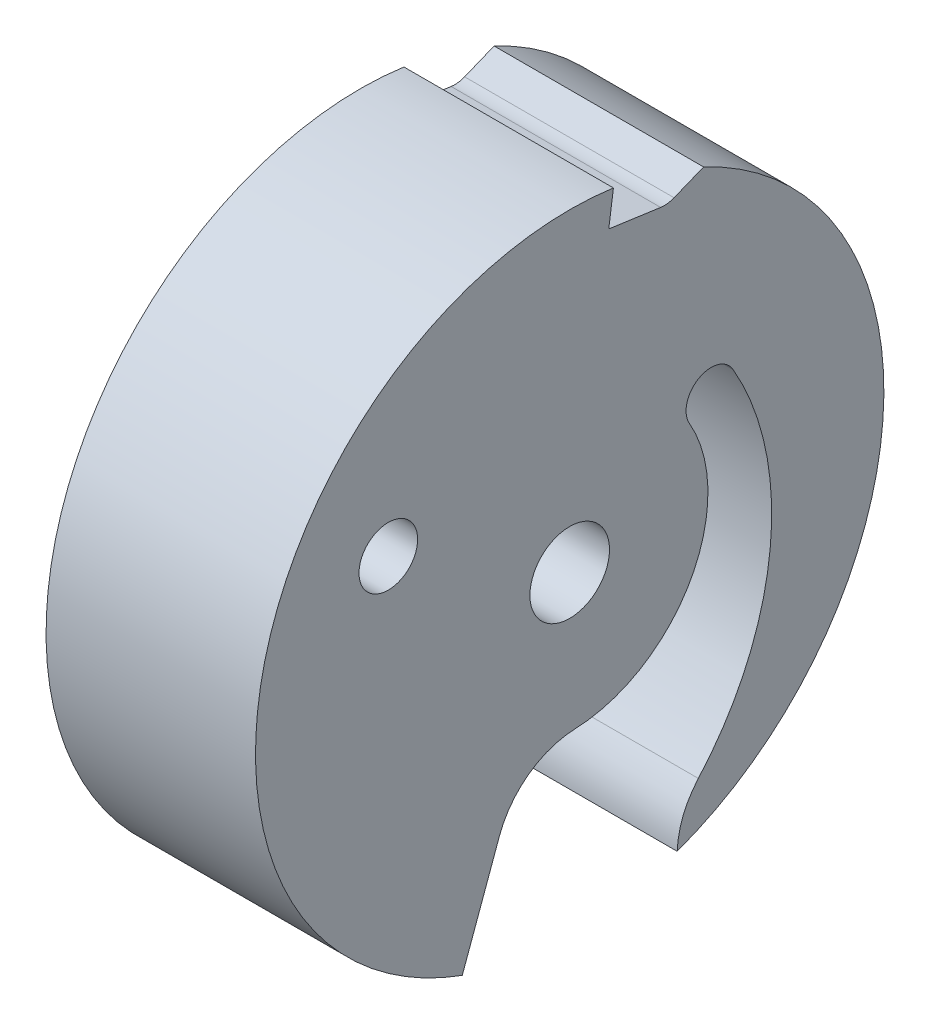
ISO-10303-21;
HEADER;
FILE_DESCRIPTION(('STEP AP214'),'2;1');
FILE_NAME('part.step','',(''),(''),'','','');
FILE_SCHEMA(('AUTOMOTIVE_DESIGN { 1 0 10303 214 1 1 1 1 }'));
ENDSEC;
DATA;
#1=APPLICATION_CONTEXT('core data for automotive mechanical design processes');
#2=APPLICATION_PROTOCOL_DEFINITION('international standard','automotive_design',2000,#1);
#3=PRODUCT_CONTEXT('',#1,'mechanical');
#4=PRODUCT('Part','Part','',(#3));
#5=PRODUCT_RELATED_PRODUCT_CATEGORY('part','',(#4));
#6=PRODUCT_DEFINITION_FORMATION('','',#4);
#7=PRODUCT_DEFINITION_CONTEXT('part definition',#1,'design');
#8=PRODUCT_DEFINITION('design','',#6,#7);
#9=PRODUCT_DEFINITION_SHAPE('','',#8);
#10=(LENGTH_UNIT() NAMED_UNIT(*) SI_UNIT(.MILLI.,.METRE.));
#11=(NAMED_UNIT(*) PLANE_ANGLE_UNIT() SI_UNIT($,.RADIAN.));
#12=(NAMED_UNIT(*) SI_UNIT($,.STERADIAN.) SOLID_ANGLE_UNIT());
#13=UNCERTAINTY_MEASURE_WITH_UNIT(LENGTH_MEASURE(1.E-05),#10,'distance_accuracy_value','');
#14=(GEOMETRIC_REPRESENTATION_CONTEXT(3) GLOBAL_UNCERTAINTY_ASSIGNED_CONTEXT((#13)) GLOBAL_UNIT_ASSIGNED_CONTEXT((#10,
#11,#12)) REPRESENTATION_CONTEXT('',''));
#15=CARTESIAN_POINT('',(0.,0.,0.));
#16=DIRECTION('',(0.,0.,1.));
#17=DIRECTION('',(1.,0.,0.));
#18=AXIS2_PLACEMENT_3D('',#15,#16,#17);
#19=CARTESIAN_POINT('',(3.175,0.,0.));
#20=DIRECTION('',(-1.,0.,0.));
#21=DIRECTION('',(0.,0.,1.));
#22=AXIS2_PLACEMENT_3D('',#19,#20,#21);
#23=CYLINDRICAL_SURFACE('',#22,1.2065);
#24=CARTESIAN_POINT('',(3.175,0.,0.));
#25=DIRECTION('',(1.,0.,0.));
#26=DIRECTION('',(0.,0.,-1.));
#27=AXIS2_PLACEMENT_3D('',#24,#25,#26);
#28=CIRCLE('',#27,1.2065);
#29=CARTESIAN_POINT('',(3.175,0.,-1.2065));
#30=VERTEX_POINT('',#29);
#31=EDGE_CURVE('E575',#30,#30,#28,.T.);
#32=ORIENTED_EDGE('',*,*,#31,.T.);
#33=EDGE_LOOP('',(#32));
#34=FACE_BOUND('',#33,.T.);
#35=CARTESIAN_POINT('',(-1.905,0.,0.));
#36=DIRECTION('',(-1.,0.,0.));
#37=DIRECTION('',(0.,0.,1.));
#38=AXIS2_PLACEMENT_3D('',#35,#36,#37);
#39=CIRCLE('',#38,1.2065);
#40=CARTESIAN_POINT('',(-1.905,0.,1.2065));
#41=VERTEX_POINT('',#40);
#42=EDGE_CURVE('E513',#41,#41,#39,.T.);
#43=ORIENTED_EDGE('',*,*,#42,.T.);
#44=EDGE_LOOP('',(#43));
#45=FACE_BOUND('',#44,.T.);
#46=ADVANCED_FACE('F372',(#34,#45),#23,.F.);
#47=CARTESIAN_POINT('',(3.175,0.,0.));
#48=DIRECTION('',(-1.,0.,0.));
#49=DIRECTION('',(0.,0.,1.));
#50=AXIS2_PLACEMENT_3D('',#47,#48,#49);
#51=CYLINDRICAL_SURFACE('',#50,9.525);
#52=CARTESIAN_POINT('',(-3.175,0.,0.));
#53=DIRECTION('',(1.,0.,0.));
#54=DIRECTION('',(0.,0.,-1.));
#55=AXIS2_PLACEMENT_3D('',#52,#53,#54);
#56=CIRCLE('',#55,9.525);
#57=CARTESIAN_POINT('',(-3.175,-8.95057221298578,-3.25774186517699));
#58=VERTEX_POINT('',#57);
#59=CARTESIAN_POINT('',(-3.175,8.61687533606395,-4.05895115057238));
#60=VERTEX_POINT('',#59);
#61=EDGE_CURVE('E586',#58,#60,#56,.T.);
#62=ORIENTED_EDGE('',*,*,#61,.T.);
#63=DIRECTION('',(1.,0.,0.));
#64=VECTOR('',#63,1.);
#65=CARTESIAN_POINT('',(-3.175,8.61687533606395,-4.05895115057238));
#66=LINE('',#65,#64);
#67=CARTESIAN_POINT('',(3.175,8.61687533606395,-4.05895115057238));
#68=VERTEX_POINT('',#67);
#69=EDGE_CURVE('E559',#60,#68,#66,.T.);
#70=ORIENTED_EDGE('',*,*,#69,.T.);
#71=CARTESIAN_POINT('',(3.175,0.,0.));
#72=DIRECTION('',(1.,0.,0.));
#73=DIRECTION('',(0.,0.,-1.));
#74=AXIS2_PLACEMENT_3D('',#71,#72,#73);
#75=CIRCLE('',#74,9.525);
#76=CARTESIAN_POINT('',(3.175,-8.95057221298578,-3.25774186517699));
#77=VERTEX_POINT('',#76);
#78=EDGE_CURVE('E600',#77,#68,#75,.T.);
#79=ORIENTED_EDGE('',*,*,#78,.F.);
#80=DIRECTION('',(-1.,0.,0.));
#81=VECTOR('',#80,1.);
#82=CARTESIAN_POINT('',(3.175,-8.95057221298578,-3.25774186517699));
#83=LINE('',#82,#81);
#84=EDGE_CURVE('E609',#77,#58,#83,.T.);
#85=ORIENTED_EDGE('',*,*,#84,.T.);
#86=EDGE_LOOP('',(#62,#70,#79,#85));
#87=FACE_BOUND('',#86,.T.);
#88=ADVANCED_FACE('F666',(#87),#51,.T.);
#89=CARTESIAN_POINT('',(3.175,0.,0.));
#90=DIRECTION('',(-1.,0.,0.));
#91=DIRECTION('',(0.,0.,1.));
#92=AXIS2_PLACEMENT_3D('',#89,#90,#91);
#93=PLANE('',#92);
#94=ORIENTED_EDGE('',*,*,#31,.F.);
#95=EDGE_LOOP('',(#94));
#96=FACE_BOUND('',#95,.T.);
#97=CARTESIAN_POINT('',(3.175,-1.52448879232104,2.64049204386923));
#98=DIRECTION('',(-1.,0.,0.));
#99=DIRECTION('',(0.,0.,-1.));
#100=AXIS2_PLACEMENT_3D('',#97,#98,#99);
#101=CIRCLE('',#100,8.76397758464196);
#102=CARTESIAN_POINT('',(3.175,2.85750000000009,-4.94933518262801));
#103=VERTEX_POINT('',#102);
#104=CARTESIAN_POINT('',(3.175,-7.35770857091965,-3.90021511351618));
#105=VERTEX_POINT('',#104);
#106=EDGE_CURVE('E596',#103,#105,#101,.T.);
#107=ORIENTED_EDGE('',*,*,#106,.T.);
#108=CARTESIAN_POINT('',(3.175,-9.04830831225226,-5.79586078573611));
#109=DIRECTION('',(-1.,0.,0.));
#110=DIRECTION('',(0.,0.,1.));
#111=AXIS2_PLACEMENT_3D('',#108,#109,#110);
#112=CIRCLE('',#111,2.54);
#113=EDGE_CURVE('E627',#105,#77,#112,.F.);
#114=ORIENTED_EDGE('',*,*,#113,.T.);
#115=ORIENTED_EDGE('',*,*,#78,.T.);
#116=DIRECTION('',(0.,0.374606593415921,-0.927183854566784));
#117=VECTOR('',#116,1.);
#118=CARTESIAN_POINT('',(3.175,8.25532679414917,-3.16408710760731));
#119=LINE('',#118,#117);
#120=CARTESIAN_POINT('',(3.175,8.25532679414917,-3.16408710760731));
#121=VERTEX_POINT('',#120);
#122=EDGE_CURVE('E544',#121,#68,#119,.T.);
#123=ORIENTED_EDGE('',*,*,#122,.F.);
#124=CARTESIAN_POINT('',(3.175,8.99127897871156,-2.86674312408343));
#125=DIRECTION('',(1.,0.,0.));
#126=DIRECTION('',(0.,0.,1.));
#127=AXIS2_PLACEMENT_3D('',#124,#125,#126);
#128=CIRCLE('',#127,0.793749999999998);
#129=CARTESIAN_POINT('',(3.175,8.20525369914794,-2.75627447519638));
#130=VERTEX_POINT('',#129);
#131=EDGE_CURVE('E541',#130,#121,#128,.T.);
#132=ORIENTED_EDGE('',*,*,#131,.F.);
#133=DIRECTION('',(0.,-0.139173100960057,-0.990268068741571));
#134=VECTOR('',#133,1.);
#135=CARTESIAN_POINT('',(3.175,8.42619099692203,-1.18422391606914));
#136=LINE('',#135,#134);
#137=CARTESIAN_POINT('',(3.175,8.42619099692203,-1.18422391606914));
#138=VERTEX_POINT('',#137);
#139=EDGE_CURVE('E538',#138,#130,#136,.T.);
#140=ORIENTED_EDGE('',*,*,#139,.F.);
#141=DIRECTION('',(0.,-0.990268068741571,0.139173100960059));
#142=VECTOR('',#141,1.);
#143=CARTESIAN_POINT('',(3.175,9.43230335476347,-1.32562378664456));
#144=LINE('',#143,#142);
#145=CARTESIAN_POINT('',(3.175,9.43230335476347,-1.32562378664456));
#146=VERTEX_POINT('',#145);
#147=EDGE_CURVE('E535',#146,#138,#144,.T.);
#148=ORIENTED_EDGE('',*,*,#147,.F.);
#149=CARTESIAN_POINT('',(3.175,-8.95057221298578,3.257741865177));
#150=VERTEX_POINT('',#149);
#151=EDGE_CURVE('E599',#146,#150,#75,.T.);
#152=ORIENTED_EDGE('',*,*,#151,.T.);
#153=DIRECTION('',(0.,0.939692620785908,-0.342020143325669));
#154=VECTOR('',#153,1.);
#155=CARTESIAN_POINT('',(3.175,-4.191,1.52539925180966));
#156=LINE('',#155,#154);
#157=CARTESIAN_POINT('',(3.175,-5.85744119700599,2.13193424467478));
#158=VERTEX_POINT('',#157);
#159=EDGE_CURVE('E603',#150,#158,#156,.T.);
#160=ORIENTED_EDGE('',*,*,#159,.T.);
#161=CARTESIAN_POINT('',(3.175,-6.72617236105319,-0.25488501212143));
#162=DIRECTION('',(-1.,0.,0.));
#163=DIRECTION('',(0.,0.,1.));
#164=AXIS2_PLACEMENT_3D('',#161,#162,#163);
#165=CIRCLE('',#164,2.54);
#166=CARTESIAN_POINT('',(3.175,-4.18799411159915,-0.158701988679381));
#167=VERTEX_POINT('',#166);
#168=EDGE_CURVE('E631',#158,#167,#165,.T.);
#169=ORIENTED_EDGE('',*,*,#168,.T.);
#170=CARTESIAN_POINT('',(3.175,0.,0.));
#171=DIRECTION('',(1.,0.,0.));
#172=DIRECTION('',(0.,0.,1.));
#173=AXIS2_PLACEMENT_3D('',#170,#171,#172);
#174=CIRCLE('',#173,4.191);
#175=CARTESIAN_POINT('',(3.175,2.09550000000007,-3.62951246726054));
#176=VERTEX_POINT('',#175);
#177=EDGE_CURVE('E592',#167,#176,#174,.T.);
#178=ORIENTED_EDGE('',*,*,#177,.T.);
#179=CARTESIAN_POINT('',(3.175,2.47650000000008,-4.28942382494427));
#180=DIRECTION('',(-1.,0.,0.));
#181=DIRECTION('',(0.,0.,1.));
#182=AXIS2_PLACEMENT_3D('',#179,#180,#181);
#183=CIRCLE('',#182,0.762);
#184=EDGE_CURVE('E594',#176,#103,#183,.T.);
#185=ORIENTED_EDGE('',*,*,#184,.T.);
#186=EDGE_LOOP('',(#107,#114,#115,#123,#132,#140,#148,#152,#160,#169,#178,#185));
#187=FACE_BOUND('',#186,.T.);
#188=CARTESIAN_POINT('',(3.175,3.17499999999997,5.49926131403121));
#189=DIRECTION('',(1.,0.,0.));
#190=DIRECTION('',(0.,0.,-1.));
#191=AXIS2_PLACEMENT_3D('',#188,#189,#190);
#192=CIRCLE('',#191,0.888999999999991);
#193=CARTESIAN_POINT('',(3.175,3.17499999999997,4.61026131403121));
#194=VERTEX_POINT('',#193);
#195=EDGE_CURVE('E572',#194,#194,#192,.T.);
#196=ORIENTED_EDGE('',*,*,#195,.F.);
#197=EDGE_LOOP('',(#196));
#198=FACE_BOUND('',#197,.T.);
#199=ADVANCED_FACE('F674',(#96,#187,#198),#93,.F.);
#200=CARTESIAN_POINT('',(-3.175,0.,0.));
#201=DIRECTION('',(-1.,0.,0.));
#202=DIRECTION('',(0.,0.,1.));
#203=AXIS2_PLACEMENT_3D('',#200,#201,#202);
#204=PLANE('',#203);
#205=CARTESIAN_POINT('',(-3.175,0.,0.));
#206=DIRECTION('',(-1.,0.,0.));
#207=DIRECTION('',(0.,0.,1.));
#208=AXIS2_PLACEMENT_3D('',#205,#206,#207);
#209=CIRCLE('',#208,1.905);
#210=CARTESIAN_POINT('',(-3.175,1.905,0.));
#211=VERTEX_POINT('',#210);
#212=CARTESIAN_POINT('',(-3.175,-1.82320636791788,0.552216931996572));
#213=VERTEX_POINT('',#212);
#214=EDGE_CURVE('E510',#211,#213,#209,.T.);
#215=ORIENTED_EDGE('',*,*,#214,.F.);
#216=DIRECTION('',(0.,0.,-1.));
#217=VECTOR('',#216,1.);
#218=CARTESIAN_POINT('',(-3.175,1.905,0.));
#219=LINE('',#218,#217);
#220=CARTESIAN_POINT('',(-3.175,1.90499999999998,6.82625000000001));
#221=VERTEX_POINT('',#220);
#222=EDGE_CURVE('E497',#221,#211,#219,.T.);
#223=ORIENTED_EDGE('',*,*,#222,.F.);
#224=CARTESIAN_POINT('',(-3.175,1.11124999999998,6.82625));
#225=DIRECTION('',(-1.,0.,0.));
#226=DIRECTION('',(0.,0.,1.));
#227=AXIS2_PLACEMENT_3D('',#224,#225,#226);
#228=CIRCLE('',#227,0.79375);
#229=CARTESIAN_POINT('',(-3.175,1.11124999999997,7.62));
#230=VERTEX_POINT('',#229);
#231=EDGE_CURVE('E11',#221,#230,#228,.F.);
#232=ORIENTED_EDGE('',*,*,#231,.T.);
#233=DIRECTION('',(0.,1.,0.));
#234=VECTOR('',#233,1.);
#235=CARTESIAN_POINT('',(-3.175,1.90499999999997,7.62000000000001));
#236=LINE('',#235,#234);
#237=CARTESIAN_POINT('',(-3.175,0.906446802250329,7.62));
#238=VERTEX_POINT('',#237);
#239=EDGE_CURVE('E506',#238,#230,#236,.T.);
#240=ORIENTED_EDGE('',*,*,#239,.F.);
#241=CARTESIAN_POINT('',(-3.175,0.90644680225033,6.82625));
#242=DIRECTION('',(-1.,0.,0.));
#243=DIRECTION('',(0.,0.,1.));
#244=AXIS2_PLACEMENT_3D('',#241,#242,#243);
#245=CIRCLE('',#244,0.79375);
#246=CARTESIAN_POINT('',(-3.175,0.146777482284549,7.05634038833191));
#247=VERTEX_POINT('',#246);
#248=EDGE_CURVE('E380',#238,#247,#245,.F.);
#249=ORIENTED_EDGE('',*,*,#248,.T.);
#250=DIRECTION('',(0.,0.289877654591376,0.957063710193111));
#251=VECTOR('',#250,1.);
#252=CARTESIAN_POINT('',(-3.175,0.317499999999973,7.62));
#253=LINE('',#252,#251);
#254=EDGE_CURVE('E520',#213,#247,#253,.T.);
#255=ORIENTED_EDGE('',*,*,#254,.F.);
#256=EDGE_LOOP('',(#215,#223,#232,#240,#249,#255));
#257=FACE_BOUND('',#256,.T.);
#258=ORIENTED_EDGE('',*,*,#61,.F.);
#259=CARTESIAN_POINT('',(-3.175,-9.04830831225226,-5.79586078573611));
#260=DIRECTION('',(-1.,0.,0.));
#261=DIRECTION('',(0.,0.,1.));
#262=AXIS2_PLACEMENT_3D('',#259,#260,#261);
#263=CIRCLE('',#262,2.54);
#264=CARTESIAN_POINT('',(-3.175,-7.35770857091965,-3.90021511351618));
#265=VERTEX_POINT('',#264);
#266=EDGE_CURVE('E623',#58,#265,#263,.T.);
#267=ORIENTED_EDGE('',*,*,#266,.T.);
#268=CARTESIAN_POINT('',(-3.175,-1.52448879232104,2.64049204386923));
#269=DIRECTION('',(-1.,0.,0.));
#270=DIRECTION('',(0.,0.,-1.));
#271=AXIS2_PLACEMENT_3D('',#268,#269,#270);
#272=CIRCLE('',#271,8.76397758464196);
#273=CARTESIAN_POINT('',(-3.175,2.85750000000009,-4.94933518262801));
#274=VERTEX_POINT('',#273);
#275=EDGE_CURVE('E582',#274,#265,#272,.T.);
#276=ORIENTED_EDGE('',*,*,#275,.F.);
#277=CARTESIAN_POINT('',(-3.175,2.47650000000008,-4.28942382494427));
#278=DIRECTION('',(-1.,0.,0.));
#279=DIRECTION('',(0.,0.,1.));
#280=AXIS2_PLACEMENT_3D('',#277,#278,#279);
#281=CIRCLE('',#280,0.762);
#282=CARTESIAN_POINT('',(-3.175,2.09550000000007,-3.62951246726054));
#283=VERTEX_POINT('',#282);
#284=EDGE_CURVE('E580',#283,#274,#281,.T.);
#285=ORIENTED_EDGE('',*,*,#284,.F.);
#286=CARTESIAN_POINT('',(-3.175,0.,0.));
#287=DIRECTION('',(1.,0.,0.));
#288=DIRECTION('',(0.,0.,1.));
#289=AXIS2_PLACEMENT_3D('',#286,#287,#288);
#290=CIRCLE('',#289,4.191);
#291=CARTESIAN_POINT('',(-3.175,-4.18799411159915,-0.158701988679381));
#292=VERTEX_POINT('',#291);
#293=EDGE_CURVE('E578',#292,#283,#290,.T.);
#294=ORIENTED_EDGE('',*,*,#293,.F.);
#295=CARTESIAN_POINT('',(-3.175,-6.72617236105319,-0.25488501212143));
#296=DIRECTION('',(-1.,0.,0.));
#297=DIRECTION('',(0.,0.,1.));
#298=AXIS2_PLACEMENT_3D('',#295,#296,#297);
#299=CIRCLE('',#298,2.54);
#300=CARTESIAN_POINT('',(-3.175,-5.85744119700599,2.13193424467478));
#301=VERTEX_POINT('',#300);
#302=EDGE_CURVE('E629',#292,#301,#299,.F.);
#303=ORIENTED_EDGE('',*,*,#302,.T.);
#304=DIRECTION('',(0.,0.939692620785908,-0.342020143325669));
#305=VECTOR('',#304,1.);
#306=CARTESIAN_POINT('',(-3.175,-4.191,1.52539925180966));
#307=LINE('',#306,#305);
#308=CARTESIAN_POINT('',(-3.175,-8.95057221298578,3.257741865177));
#309=VERTEX_POINT('',#308);
#310=EDGE_CURVE('E589',#309,#301,#307,.T.);
#311=ORIENTED_EDGE('',*,*,#310,.F.);
#312=CARTESIAN_POINT('',(-3.175,9.43230335476347,-1.32562378664456));
#313=VERTEX_POINT('',#312);
#314=EDGE_CURVE('E585',#313,#309,#56,.T.);
#315=ORIENTED_EDGE('',*,*,#314,.F.);
#316=DIRECTION('',(0.,-0.990268068741571,0.139173100960059));
#317=VECTOR('',#316,1.);
#318=CARTESIAN_POINT('',(-3.175,9.43230335476347,-1.32562378664456));
#319=LINE('',#318,#317);
#320=CARTESIAN_POINT('',(-3.175,8.42619099692203,-1.18422391606914));
#321=VERTEX_POINT('',#320);
#322=EDGE_CURVE('E546',#313,#321,#319,.T.);
#323=ORIENTED_EDGE('',*,*,#322,.T.);
#324=DIRECTION('',(0.,-0.139173100960057,-0.990268068741571));
#325=VECTOR('',#324,1.);
#326=CARTESIAN_POINT('',(-3.175,8.42619099692203,-1.18422391606914));
#327=LINE('',#326,#325);
#328=CARTESIAN_POINT('',(-3.175,8.20525369914794,-2.75627447519638));
#329=VERTEX_POINT('',#328);
#330=EDGE_CURVE('E549',#321,#329,#327,.T.);
#331=ORIENTED_EDGE('',*,*,#330,.T.);
#332=CARTESIAN_POINT('',(-3.175,8.99127897871156,-2.86674312408343));
#333=DIRECTION('',(1.,0.,0.));
#334=DIRECTION('',(0.,0.,1.));
#335=AXIS2_PLACEMENT_3D('',#332,#333,#334);
#336=CIRCLE('',#335,0.793749999999998);
#337=CARTESIAN_POINT('',(-3.175,8.25532679414917,-3.16408710760731));
#338=VERTEX_POINT('',#337);
#339=EDGE_CURVE('E552',#329,#338,#336,.T.);
#340=ORIENTED_EDGE('',*,*,#339,.T.);
#341=DIRECTION('',(0.,0.374606593415921,-0.927183854566784));
#342=VECTOR('',#341,1.);
#343=CARTESIAN_POINT('',(-3.175,8.25532679414917,-3.16408710760731));
#344=LINE('',#343,#342);
#345=EDGE_CURVE('E555',#338,#60,#344,.T.);
#346=ORIENTED_EDGE('',*,*,#345,.T.);
#347=EDGE_LOOP('',(#258,#267,#276,#285,#294,#303,#311,#315,#323,#331,#340,#346));
#348=FACE_BOUND('',#347,.T.);
#349=CARTESIAN_POINT('',(-3.175,3.17499999999997,5.49926131403121));
#350=DIRECTION('',(1.,0.,0.));
#351=DIRECTION('',(0.,0.,-1.));
#352=AXIS2_PLACEMENT_3D('',#349,#350,#351);
#353=CIRCLE('',#352,0.888999999999991);
#354=CARTESIAN_POINT('',(-3.175,3.17499999999997,4.61026131403121));
#355=VERTEX_POINT('',#354);
#356=EDGE_CURVE('E562',#355,#355,#353,.T.);
#357=ORIENTED_EDGE('',*,*,#356,.T.);
#358=EDGE_LOOP('',(#357));
#359=FACE_BOUND('',#358,.T.);
#360=ADVANCED_FACE('F517',(#257,#348,#359),#204,.T.);
#361=CARTESIAN_POINT('',(3.175,0.,0.));
#362=DIRECTION('',(-1.,0.,0.));
#363=DIRECTION('',(0.,0.,1.));
#364=AXIS2_PLACEMENT_3D('',#361,#362,#363);
#365=CYLINDRICAL_SURFACE('',#364,4.191);
#366=ORIENTED_EDGE('',*,*,#177,.F.);
#367=DIRECTION('',(-1.,0.,0.));
#368=VECTOR('',#367,1.);
#369=CARTESIAN_POINT('',(3.175,-4.18799411159916,-0.158701988679381));
#370=LINE('',#369,#368);
#371=EDGE_CURVE('E618',#167,#292,#370,.T.);
#372=ORIENTED_EDGE('',*,*,#371,.T.);
#373=ORIENTED_EDGE('',*,*,#293,.T.);
#374=DIRECTION('',(-1.,0.,0.));
#375=VECTOR('',#374,1.);
#376=CARTESIAN_POINT('',(3.175,2.09550000000007,-3.62951246726054));
#377=LINE('',#376,#375);
#378=EDGE_CURVE('E615',#176,#283,#377,.T.);
#379=ORIENTED_EDGE('',*,*,#378,.F.);
#380=EDGE_LOOP('',(#366,#372,#373,#379));
#381=FACE_BOUND('',#380,.T.);
#382=ADVANCED_FACE('F374',(#381),#365,.T.);
#383=CARTESIAN_POINT('',(3.175,2.47650000000008,-4.28942382494427));
#384=DIRECTION('',(-1.,0.,0.));
#385=DIRECTION('',(0.,0.,1.));
#386=AXIS2_PLACEMENT_3D('',#383,#384,#385);
#387=CYLINDRICAL_SURFACE('',#386,0.762);
#388=ORIENTED_EDGE('',*,*,#284,.T.);
#389=DIRECTION('',(-1.,0.,0.));
#390=VECTOR('',#389,1.);
#391=CARTESIAN_POINT('',(3.175,2.85750000000009,-4.94933518262801));
#392=LINE('',#391,#390);
#393=EDGE_CURVE('E612',#103,#274,#392,.T.);
#394=ORIENTED_EDGE('',*,*,#393,.F.);
#395=ORIENTED_EDGE('',*,*,#184,.F.);
#396=ORIENTED_EDGE('',*,*,#378,.T.);
#397=EDGE_LOOP('',(#388,#394,#395,#396));
#398=FACE_BOUND('',#397,.T.);
#399=ADVANCED_FACE('F696',(#398),#387,.F.);
#400=CARTESIAN_POINT('',(3.175,-1.52448879232104,2.64049204386923));
#401=DIRECTION('',(-1.,0.,0.));
#402=DIRECTION('',(0.,0.,1.));
#403=AXIS2_PLACEMENT_3D('',#400,#401,#402);
#404=CYLINDRICAL_SURFACE('',#403,8.76397758464196);
#405=ORIENTED_EDGE('',*,*,#275,.T.);
#406=DIRECTION('',(-1.,0.,0.));
#407=VECTOR('',#406,1.);
#408=CARTESIAN_POINT('',(3.175,-7.35770857091965,-3.90021511351618));
#409=LINE('',#408,#407);
#410=EDGE_CURVE('E625',#265,#105,#409,.F.);
#411=ORIENTED_EDGE('',*,*,#410,.T.);
#412=ORIENTED_EDGE('',*,*,#106,.F.);
#413=ORIENTED_EDGE('',*,*,#393,.T.);
#414=EDGE_LOOP('',(#405,#411,#412,#413));
#415=FACE_BOUND('',#414,.T.);
#416=ADVANCED_FACE('F693',(#415),#404,.F.);
#417=ORIENTED_EDGE('',*,*,#151,.F.);
#418=DIRECTION('',(1.,0.,0.));
#419=VECTOR('',#418,1.);
#420=CARTESIAN_POINT('',(-3.175,9.43230335476347,-1.32562378664456));
#421=LINE('',#420,#419);
#422=EDGE_CURVE('E558',#313,#146,#421,.T.);
#423=ORIENTED_EDGE('',*,*,#422,.F.);
#424=ORIENTED_EDGE('',*,*,#314,.T.);
#425=DIRECTION('',(-1.,0.,0.));
#426=VECTOR('',#425,1.);
#427=CARTESIAN_POINT('',(3.175,-8.95057221298578,3.257741865177));
#428=LINE('',#427,#426);
#429=EDGE_CURVE('E606',#150,#309,#428,.T.);
#430=ORIENTED_EDGE('',*,*,#429,.F.);
#431=EDGE_LOOP('',(#417,#423,#424,#430));
#432=FACE_BOUND('',#431,.T.);
#433=ADVANCED_FACE('F677',(#432),#51,.T.);
#434=CARTESIAN_POINT('',(3.175,-4.191,1.52539925180966));
#435=DIRECTION('',(0.,0.342020143325669,0.939692620785908));
#436=DIRECTION('',(0.,-0.939692620785908,0.342020143325669));
#437=AXIS2_PLACEMENT_3D('',#434,#435,#436);
#438=PLANE('',#437);
#439=ORIENTED_EDGE('',*,*,#310,.T.);
#440=DIRECTION('',(1.,0.,0.));
#441=VECTOR('',#440,1.);
#442=CARTESIAN_POINT('',(3.175,-5.85744119700599,2.13193424467478));
#443=LINE('',#442,#441);
#444=EDGE_CURVE('E621',#301,#158,#443,.T.);
#445=ORIENTED_EDGE('',*,*,#444,.T.);
#446=ORIENTED_EDGE('',*,*,#159,.F.);
#447=ORIENTED_EDGE('',*,*,#429,.T.);
#448=EDGE_LOOP('',(#439,#445,#446,#447));
#449=FACE_BOUND('',#448,.T.);
#450=ADVANCED_FACE('F688',(#449),#438,.F.);
#451=CARTESIAN_POINT('',(3.175,3.17499999999997,5.49926131403121));
#452=DIRECTION('',(-1.,0.,0.));
#453=DIRECTION('',(0.,0.,1.));
#454=AXIS2_PLACEMENT_3D('',#451,#452,#453);
#455=CYLINDRICAL_SURFACE('',#454,0.888999999999991);
#456=ORIENTED_EDGE('',*,*,#195,.T.);
#457=EDGE_LOOP('',(#456));
#458=FACE_BOUND('',#457,.T.);
#459=ORIENTED_EDGE('',*,*,#356,.F.);
#460=EDGE_LOOP('',(#459));
#461=FACE_BOUND('',#460,.T.);
#462=ADVANCED_FACE('F681',(#458,#461),#455,.F.);
#463=CARTESIAN_POINT('',(-3.175,8.25532679414917,-3.16408710760731));
#464=DIRECTION('',(0.,-0.927183854566784,-0.374606593415921));
#465=DIRECTION('',(0.,0.374606593415921,-0.927183854566784));
#466=AXIS2_PLACEMENT_3D('',#463,#464,#465);
#467=PLANE('',#466);
#468=ORIENTED_EDGE('',*,*,#122,.T.);
#469=ORIENTED_EDGE('',*,*,#69,.F.);
#470=ORIENTED_EDGE('',*,*,#345,.F.);
#471=DIRECTION('',(1.,0.,0.));
#472=VECTOR('',#471,1.);
#473=CARTESIAN_POINT('',(-3.175,8.25532679414917,-3.16408710760731));
#474=LINE('',#473,#472);
#475=EDGE_CURVE('E563',#338,#121,#474,.T.);
#476=ORIENTED_EDGE('',*,*,#475,.T.);
#477=EDGE_LOOP('',(#468,#469,#470,#476));
#478=FACE_BOUND('',#477,.T.);
#479=ADVANCED_FACE('F748',(#478),#467,.F.);
#480=CARTESIAN_POINT('',(-3.175,8.99127897871156,-2.86674312408343));
#481=DIRECTION('',(1.,0.,0.));
#482=DIRECTION('',(0.,0.,-1.));
#483=AXIS2_PLACEMENT_3D('',#480,#481,#482);
#484=CYLINDRICAL_SURFACE('',#483,0.793749999999998);
#485=ORIENTED_EDGE('',*,*,#131,.T.);
#486=ORIENTED_EDGE('',*,*,#475,.F.);
#487=ORIENTED_EDGE('',*,*,#339,.F.);
#488=DIRECTION('',(1.,0.,0.));
#489=VECTOR('',#488,1.);
#490=CARTESIAN_POINT('',(-3.175,8.20525369914794,-2.75627447519638));
#491=LINE('',#490,#489);
#492=EDGE_CURVE('E565',#329,#130,#491,.T.);
#493=ORIENTED_EDGE('',*,*,#492,.T.);
#494=EDGE_LOOP('',(#485,#486,#487,#493));
#495=FACE_BOUND('',#494,.T.);
#496=ADVANCED_FACE('F745',(#495),#484,.F.);
#497=CARTESIAN_POINT('',(-3.175,8.42619099692203,-1.18422391606914));
#498=DIRECTION('',(0.,-0.990268068741571,0.139173100960057));
#499=DIRECTION('',(0.,-0.139173100960057,-0.990268068741572));
#500=AXIS2_PLACEMENT_3D('',#497,#498,#499);
#501=PLANE('',#500);
#502=ORIENTED_EDGE('',*,*,#139,.T.);
#503=ORIENTED_EDGE('',*,*,#492,.F.);
#504=ORIENTED_EDGE('',*,*,#330,.F.);
#505=DIRECTION('',(1.,0.,0.));
#506=VECTOR('',#505,1.);
#507=CARTESIAN_POINT('',(-3.175,8.42619099692203,-1.18422391606914));
#508=LINE('',#507,#506);
#509=EDGE_CURVE('E567',#321,#138,#508,.T.);
#510=ORIENTED_EDGE('',*,*,#509,.T.);
#511=EDGE_LOOP('',(#502,#503,#504,#510));
#512=FACE_BOUND('',#511,.T.);
#513=ADVANCED_FACE('F742',(#512),#501,.F.);
#514=CARTESIAN_POINT('',(-3.175,9.43230335476347,-1.32562378664456));
#515=DIRECTION('',(0.,0.139173100960059,0.990268068741571));
#516=DIRECTION('',(0.,-0.990268068741571,0.139173100960059));
#517=AXIS2_PLACEMENT_3D('',#514,#515,#516);
#518=PLANE('',#517);
#519=ORIENTED_EDGE('',*,*,#147,.T.);
#520=ORIENTED_EDGE('',*,*,#509,.F.);
#521=ORIENTED_EDGE('',*,*,#322,.F.);
#522=ORIENTED_EDGE('',*,*,#422,.T.);
#523=EDGE_LOOP('',(#519,#520,#521,#522));
#524=FACE_BOUND('',#523,.T.);
#525=ADVANCED_FACE('F740',(#524),#518,.F.);
#526=CARTESIAN_POINT('',(3.175,-6.72617236105319,-0.25488501212143));
#527=DIRECTION('',(-1.,0.,0.));
#528=DIRECTION('',(0.,0.,1.));
#529=AXIS2_PLACEMENT_3D('',#526,#527,#528);
#530=CYLINDRICAL_SURFACE('',#529,2.54);
#531=ORIENTED_EDGE('',*,*,#168,.F.);
#532=ORIENTED_EDGE('',*,*,#444,.F.);
#533=ORIENTED_EDGE('',*,*,#302,.F.);
#534=ORIENTED_EDGE('',*,*,#371,.F.);
#535=EDGE_LOOP('',(#531,#532,#533,#534));
#536=FACE_BOUND('',#535,.T.);
#537=ADVANCED_FACE('F733',(#536),#530,.F.);
#538=CARTESIAN_POINT('',(3.175,-9.04830831225226,-5.79586078573611));
#539=DIRECTION('',(-1.,0.,0.));
#540=DIRECTION('',(0.,0.,1.));
#541=AXIS2_PLACEMENT_3D('',#538,#539,#540);
#542=CYLINDRICAL_SURFACE('',#541,2.54);
#543=ORIENTED_EDGE('',*,*,#113,.F.);
#544=ORIENTED_EDGE('',*,*,#410,.F.);
#545=ORIENTED_EDGE('',*,*,#266,.F.);
#546=ORIENTED_EDGE('',*,*,#84,.F.);
#547=EDGE_LOOP('',(#543,#544,#545,#546));
#548=FACE_BOUND('',#547,.T.);
#549=ADVANCED_FACE('F718',(#548),#542,.T.);
#550=CARTESIAN_POINT('',(-1.905,0.,0.));
#551=DIRECTION('',(-1.,0.,0.));
#552=DIRECTION('',(0.,0.,1.));
#553=AXIS2_PLACEMENT_3D('',#550,#551,#552);
#554=CYLINDRICAL_SURFACE('',#553,1.905);
#555=ORIENTED_EDGE('',*,*,#214,.T.);
#556=DIRECTION('',(-1.,0.,0.));
#557=VECTOR('',#556,1.);
#558=CARTESIAN_POINT('',(-1.905,-1.82320636791788,0.552216931996572));
#559=LINE('',#558,#557);
#560=CARTESIAN_POINT('',(-1.905,-1.82320636791788,0.552216931996572));
#561=VERTEX_POINT('',#560);
#562=EDGE_CURVE('E514',#561,#213,#559,.T.);
#563=ORIENTED_EDGE('',*,*,#562,.F.);
#564=CARTESIAN_POINT('',(-1.905,0.,0.));
#565=DIRECTION('',(-1.,0.,0.));
#566=DIRECTION('',(0.,0.,1.));
#567=AXIS2_PLACEMENT_3D('',#564,#565,#566);
#568=CIRCLE('',#567,1.905);
#569=CARTESIAN_POINT('',(-1.905,1.905,0.));
#570=VERTEX_POINT('',#569);
#571=EDGE_CURVE('E505',#570,#561,#568,.T.);
#572=ORIENTED_EDGE('',*,*,#571,.F.);
#573=DIRECTION('',(-1.,0.,0.));
#574=VECTOR('',#573,1.);
#575=CARTESIAN_POINT('',(-1.905,1.905,0.));
#576=LINE('',#575,#574);
#577=EDGE_CURVE('E500',#570,#211,#576,.T.);
#578=ORIENTED_EDGE('',*,*,#577,.T.);
#579=EDGE_LOOP('',(#555,#563,#572,#578));
#580=FACE_BOUND('',#579,.T.);
#581=ADVANCED_FACE('F509',(#580),#554,.F.);
#582=CARTESIAN_POINT('',(-1.905,1.905,0.));
#583=DIRECTION('',(0.,1.,0.));
#584=DIRECTION('',(0.,0.,1.));
#585=AXIS2_PLACEMENT_3D('',#582,#583,#584);
#586=PLANE('',#585);
#587=DIRECTION('',(0.,0.,-1.));
#588=VECTOR('',#587,1.);
#589=CARTESIAN_POINT('',(-1.905,1.905,0.));
#590=LINE('',#589,#588);
#591=CARTESIAN_POINT('',(-1.905,1.90499999999998,6.82625000000001));
#592=VERTEX_POINT('',#591);
#593=EDGE_CURVE('E532',#592,#570,#590,.T.);
#594=ORIENTED_EDGE('',*,*,#593,.F.);
#595=DIRECTION('',(-1.,0.,0.));
#596=VECTOR('',#595,1.);
#597=CARTESIAN_POINT('',(-3.175,1.90499999999998,6.82625000000001));
#598=LINE('',#597,#596);
#599=EDGE_CURVE('E502',#592,#221,#598,.T.);
#600=ORIENTED_EDGE('',*,*,#599,.T.);
#601=ORIENTED_EDGE('',*,*,#222,.T.);
#602=ORIENTED_EDGE('',*,*,#577,.F.);
#603=EDGE_LOOP('',(#594,#600,#601,#602));
#604=FACE_BOUND('',#603,.T.);
#605=ADVANCED_FACE('F499',(#604),#586,.F.);
#606=CARTESIAN_POINT('',(-1.905,1.90499999999997,7.62000000000001));
#607=DIRECTION('',(0.,0.,1.));
#608=DIRECTION('',(0.,-1.,0.));
#609=AXIS2_PLACEMENT_3D('',#606,#607,#608);
#610=PLANE('',#609);
#611=DIRECTION('',(0.,1.,0.));
#612=VECTOR('',#611,1.);
#613=CARTESIAN_POINT('',(-1.905,1.90499999999997,7.62000000000001));
#614=LINE('',#613,#612);
#615=CARTESIAN_POINT('',(-1.905,0.906446802250329,7.62));
#616=VERTEX_POINT('',#615);
#617=CARTESIAN_POINT('',(-1.905,1.11124999999997,7.62));
#618=VERTEX_POINT('',#617);
#619=EDGE_CURVE('E530',#616,#618,#614,.T.);
#620=ORIENTED_EDGE('',*,*,#619,.F.);
#621=DIRECTION('',(-1.,0.,0.));
#622=VECTOR('',#621,1.);
#623=CARTESIAN_POINT('',(-3.175,0.906446802250329,7.62));
#624=LINE('',#623,#622);
#625=EDGE_CURVE('E637',#616,#238,#624,.T.);
#626=ORIENTED_EDGE('',*,*,#625,.T.);
#627=ORIENTED_EDGE('',*,*,#239,.T.);
#628=DIRECTION('',(-1.,0.,0.));
#629=VECTOR('',#628,1.);
#630=CARTESIAN_POINT('',(-1.905,1.11124999999997,7.62));
#631=LINE('',#630,#629);
#632=EDGE_CURVE('E633',#230,#618,#631,.F.);
#633=ORIENTED_EDGE('',*,*,#632,.T.);
#634=EDGE_LOOP('',(#620,#626,#627,#633));
#635=FACE_BOUND('',#634,.T.);
#636=ADVANCED_FACE('F657',(#635),#610,.F.);
#637=CARTESIAN_POINT('',(-1.905,0.317499999999973,7.62));
#638=DIRECTION('',(0.,-0.957063710193111,0.289877654591376));
#639=DIRECTION('',(0.,-0.289877654591376,-0.957063710193111));
#640=AXIS2_PLACEMENT_3D('',#637,#638,#639);
#641=PLANE('',#640);
#642=ORIENTED_EDGE('',*,*,#254,.T.);
#643=DIRECTION('',(-1.,0.,0.));
#644=VECTOR('',#643,1.);
#645=CARTESIAN_POINT('',(-1.905,0.146777482284549,7.05634038833191));
#646=LINE('',#645,#644);
#647=CARTESIAN_POINT('',(-1.905,0.146777482284549,7.05634038833191));
#648=VERTEX_POINT('',#647);
#649=EDGE_CURVE('E640',#247,#648,#646,.F.);
#650=ORIENTED_EDGE('',*,*,#649,.T.);
#651=DIRECTION('',(0.,0.289877654591376,0.957063710193111));
#652=VECTOR('',#651,1.);
#653=CARTESIAN_POINT('',(-1.905,0.317499999999973,7.62));
#654=LINE('',#653,#652);
#655=EDGE_CURVE('E527',#561,#648,#654,.T.);
#656=ORIENTED_EDGE('',*,*,#655,.F.);
#657=ORIENTED_EDGE('',*,*,#562,.T.);
#658=EDGE_LOOP('',(#642,#650,#656,#657));
#659=FACE_BOUND('',#658,.T.);
#660=ADVANCED_FACE('F650',(#659),#641,.F.);
#661=CARTESIAN_POINT('',(-1.905,0.,0.));
#662=DIRECTION('',(-1.,0.,0.));
#663=DIRECTION('',(0.,0.,1.));
#664=AXIS2_PLACEMENT_3D('',#661,#662,#663);
#665=PLANE('',#664);
#666=ORIENTED_EDGE('',*,*,#42,.F.);
#667=EDGE_LOOP('',(#666));
#668=FACE_BOUND('',#667,.T.);
#669=ORIENTED_EDGE('',*,*,#655,.T.);
#670=CARTESIAN_POINT('',(-1.905,0.90644680225033,6.82625));
#671=DIRECTION('',(-1.,0.,0.));
#672=DIRECTION('',(0.,0.,1.));
#673=AXIS2_PLACEMENT_3D('',#670,#671,#672);
#674=CIRCLE('',#673,0.79375);
#675=EDGE_CURVE('E643',#648,#616,#674,.T.);
#676=ORIENTED_EDGE('',*,*,#675,.T.);
#677=ORIENTED_EDGE('',*,*,#619,.T.);
#678=CARTESIAN_POINT('',(-1.905,1.11124999999998,6.82625));
#679=DIRECTION('',(-1.,0.,0.));
#680=DIRECTION('',(0.,0.,1.));
#681=AXIS2_PLACEMENT_3D('',#678,#679,#680);
#682=CIRCLE('',#681,0.79375);
#683=EDGE_CURVE('E393',#618,#592,#682,.T.);
#684=ORIENTED_EDGE('',*,*,#683,.T.);
#685=ORIENTED_EDGE('',*,*,#593,.T.);
#686=ORIENTED_EDGE('',*,*,#571,.T.);
#687=EDGE_LOOP('',(#669,#676,#677,#684,#685,#686));
#688=FACE_BOUND('',#687,.T.);
#689=ADVANCED_FACE('F655',(#668,#688),#665,.T.);
#690=CARTESIAN_POINT('',(-1.905,0.90644680225033,6.82625));
#691=DIRECTION('',(1.,0.,0.));
#692=DIRECTION('',(0.,0.,-1.));
#693=AXIS2_PLACEMENT_3D('',#690,#691,#692);
#694=CYLINDRICAL_SURFACE('',#693,0.79375);
#695=ORIENTED_EDGE('',*,*,#675,.F.);
#696=ORIENTED_EDGE('',*,*,#649,.F.);
#697=ORIENTED_EDGE('',*,*,#248,.F.);
#698=ORIENTED_EDGE('',*,*,#625,.F.);
#699=EDGE_LOOP('',(#695,#696,#697,#698));
#700=FACE_BOUND('',#699,.T.);
#701=ADVANCED_FACE('F653',(#700),#694,.F.);
#702=CARTESIAN_POINT('',(-1.905,1.11124999999998,6.82625));
#703=DIRECTION('',(1.,0.,0.));
#704=DIRECTION('',(0.,0.,-1.));
#705=AXIS2_PLACEMENT_3D('',#702,#703,#704);
#706=CYLINDRICAL_SURFACE('',#705,0.79375);
#707=ORIENTED_EDGE('',*,*,#683,.F.);
#708=ORIENTED_EDGE('',*,*,#632,.F.);
#709=ORIENTED_EDGE('',*,*,#231,.F.);
#710=ORIENTED_EDGE('',*,*,#599,.F.);
#711=EDGE_LOOP('',(#707,#708,#709,#710));
#712=FACE_BOUND('',#711,.T.);
#713=ADVANCED_FACE('F658',(#712),#706,.F.);
#714=CLOSED_SHELL('',(#46,#88,#199,#360,#382,#399,#416,#433,#450,#462,#479,#496,#513,#525,#537,
#549,#581,#605,#636,#660,#689,#701,#713));
#715=MANIFOLD_SOLID_BREP('B2',#714);
#716=ADVANCED_BREP_SHAPE_REPRESENTATION('',(#18,#715),#14);
#717=SHAPE_DEFINITION_REPRESENTATION(#9,#716);
ENDSEC;
END-ISO-10303-21;
